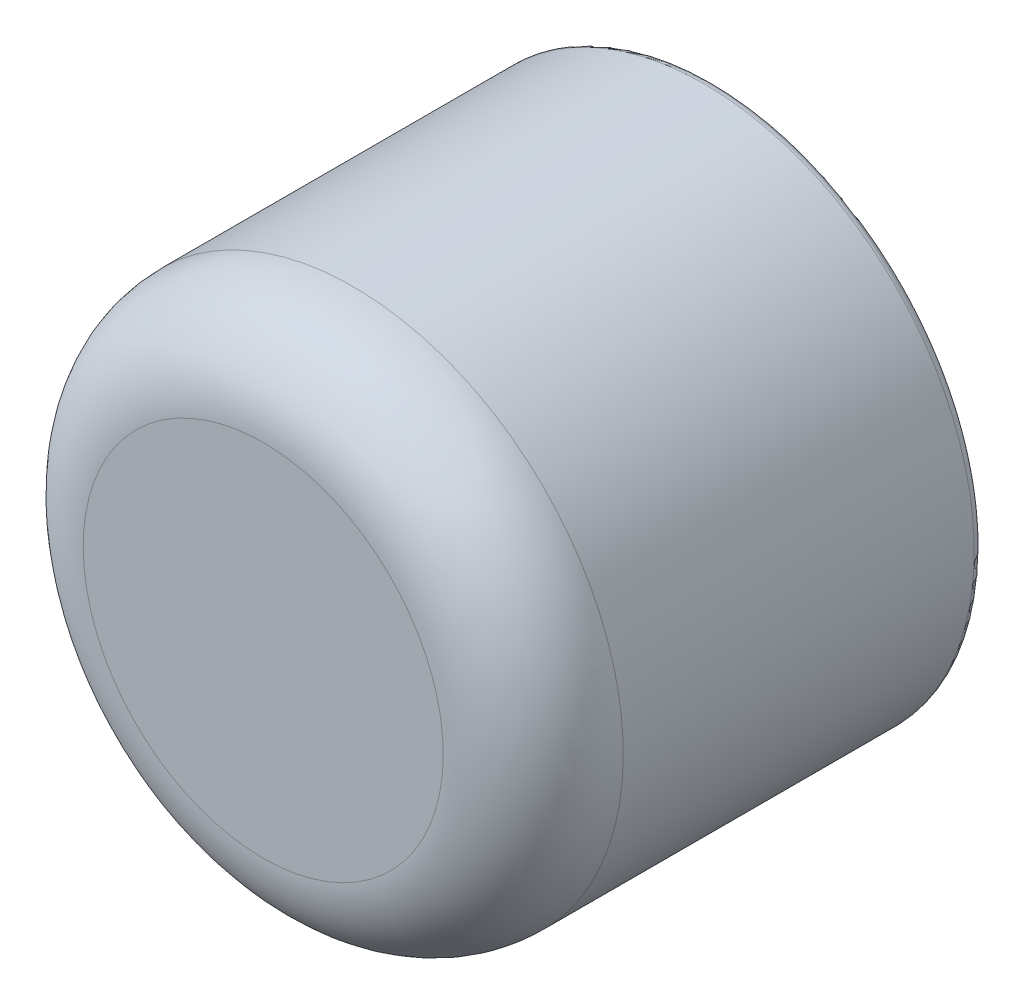
ISO-10303-21;
HEADER;
FILE_DESCRIPTION(('STEP AP214'),'2;1');
FILE_NAME('part.step','',(''),(''),'','','');
FILE_SCHEMA(('AUTOMOTIVE_DESIGN { 1 0 10303 214 1 1 1 1 }'));
ENDSEC;
DATA;
#1=APPLICATION_CONTEXT('core data for automotive mechanical design processes');
#2=APPLICATION_PROTOCOL_DEFINITION('international standard','automotive_design',2000,#1);
#3=PRODUCT_CONTEXT('',#1,'mechanical');
#4=PRODUCT('Part','Part','',(#3));
#5=PRODUCT_RELATED_PRODUCT_CATEGORY('part','',(#4));
#6=PRODUCT_DEFINITION_FORMATION('','',#4);
#7=PRODUCT_DEFINITION_CONTEXT('part definition',#1,'design');
#8=PRODUCT_DEFINITION('design','',#6,#7);
#9=PRODUCT_DEFINITION_SHAPE('','',#8);
#10=(LENGTH_UNIT() NAMED_UNIT(*) SI_UNIT(.MILLI.,.METRE.));
#11=(NAMED_UNIT(*) PLANE_ANGLE_UNIT() SI_UNIT($,.RADIAN.));
#12=(NAMED_UNIT(*) SI_UNIT($,.STERADIAN.) SOLID_ANGLE_UNIT());
#13=UNCERTAINTY_MEASURE_WITH_UNIT(LENGTH_MEASURE(1.E-05),#10,'distance_accuracy_value','');
#14=(GEOMETRIC_REPRESENTATION_CONTEXT(3) GLOBAL_UNCERTAINTY_ASSIGNED_CONTEXT((#13)) GLOBAL_UNIT_ASSIGNED_CONTEXT((#10,
#11,#12)) REPRESENTATION_CONTEXT('',''));
#15=CARTESIAN_POINT('',(0.,0.,0.));
#16=DIRECTION('',(0.,0.,1.));
#17=DIRECTION('',(1.,0.,0.));
#18=AXIS2_PLACEMENT_3D('',#15,#16,#17);
#19=CARTESIAN_POINT('',(0.,0.,12.5));
#20=DIRECTION('',(0.,0.,1.));
#21=DIRECTION('',(0.,-1.,0.));
#22=AXIS2_PLACEMENT_3D('',#19,#20,#21);
#23=PLANE('',#22);
#24=CARTESIAN_POINT('',(0.,0.,12.5));
#25=DIRECTION('',(0.,0.,1.));
#26=DIRECTION('',(0.,-1.,0.));
#27=AXIS2_PLACEMENT_3D('',#24,#25,#26);
#28=CIRCLE('',#27,10.);
#29=CARTESIAN_POINT('',(0.,-10.,12.5));
#30=VERTEX_POINT('',#29);
#31=EDGE_CURVE('E57',#30,#30,#28,.T.);
#32=ORIENTED_EDGE('',*,*,#31,.T.);
#33=EDGE_LOOP('',(#32));
#34=FACE_BOUND('',#33,.T.);
#35=ADVANCED_FACE('F41',(#34),#23,.T.);
#36=CARTESIAN_POINT('',(0.,0.,-12.5));
#37=DIRECTION('',(0.,0.,-1.));
#38=DIRECTION('',(0.,1.,0.));
#39=AXIS2_PLACEMENT_3D('',#36,#37,#38);
#40=PLANE('',#39);
#41=CARTESIAN_POINT('',(0.,0.,-12.5));
#42=DIRECTION('',(0.,0.,-1.));
#43=DIRECTION('',(0.,1.,0.));
#44=AXIS2_PLACEMENT_3D('',#41,#42,#43);
#45=CIRCLE('',#44,14.5);
#46=CARTESIAN_POINT('',(0.,14.5,-12.5));
#47=VERTEX_POINT('',#46);
#48=EDGE_CURVE('E10',#47,#47,#45,.T.);
#49=ORIENTED_EDGE('',*,*,#48,.T.);
#50=EDGE_LOOP('',(#49));
#51=FACE_BOUND('',#50,.T.);
#52=ADVANCED_FACE('F74',(#51),#40,.T.);
#53=CARTESIAN_POINT('',(0.,0.,22.3270440251572));
#54=DIRECTION('',(0.,0.,1.));
#55=DIRECTION('',(0.,-1.,0.));
#56=AXIS2_PLACEMENT_3D('',#53,#54,#55);
#57=CYLINDRICAL_SURFACE('',#56,15.);
#58=CARTESIAN_POINT('',(0.,0.,-12.));
#59=DIRECTION('',(0.,0.,-1.));
#60=DIRECTION('',(0.,1.,0.));
#61=AXIS2_PLACEMENT_3D('',#58,#59,#60);
#62=CIRCLE('',#61,15.);
#63=CARTESIAN_POINT('',(0.,15.,-12.));
#64=VERTEX_POINT('',#63);
#65=EDGE_CURVE('E48',#64,#64,#62,.F.);
#66=ORIENTED_EDGE('',*,*,#65,.T.);
#67=EDGE_LOOP('',(#66));
#68=FACE_BOUND('',#67,.T.);
#69=CARTESIAN_POINT('',(0.,0.,7.5));
#70=DIRECTION('',(0.,0.,1.));
#71=DIRECTION('',(0.,-1.,0.));
#72=AXIS2_PLACEMENT_3D('',#69,#70,#71);
#73=CIRCLE('',#72,15.);
#74=CARTESIAN_POINT('',(0.,-15.,7.5));
#75=VERTEX_POINT('',#74);
#76=EDGE_CURVE('E55',#75,#75,#73,.F.);
#77=ORIENTED_EDGE('',*,*,#76,.T.);
#78=EDGE_LOOP('',(#77));
#79=FACE_BOUND('',#78,.T.);
#80=ADVANCED_FACE('F63',(#68,#79),#57,.T.);
#81=CARTESIAN_POINT('',(0.,0.,7.5));
#82=DIRECTION('',(0.,0.,1.));
#83=DIRECTION('',(0.,-1.,0.));
#84=AXIS2_PLACEMENT_3D('',#81,#82,#83);
#85=TOROIDAL_SURFACE('',#84,10.,5.);
#86=ORIENTED_EDGE('',*,*,#76,.F.);
#87=EDGE_LOOP('',(#86));
#88=FACE_BOUND('',#87,.T.);
#89=ORIENTED_EDGE('',*,*,#31,.F.);
#90=EDGE_LOOP('',(#89));
#91=FACE_BOUND('',#90,.T.);
#92=ADVANCED_FACE('F64',(#88,#91),#85,.T.);
#93=CARTESIAN_POINT('',(0.,0.,-12.));
#94=DIRECTION('',(0.,0.,-1.));
#95=DIRECTION('',(0.,1.,0.));
#96=AXIS2_PLACEMENT_3D('',#93,#94,#95);
#97=TOROIDAL_SURFACE('',#96,14.5,0.5);
#98=ORIENTED_EDGE('',*,*,#48,.F.);
#99=EDGE_LOOP('',(#98));
#100=FACE_BOUND('',#99,.T.);
#101=ORIENTED_EDGE('',*,*,#65,.F.);
#102=EDGE_LOOP('',(#101));
#103=FACE_BOUND('',#102,.T.);
#104=ADVANCED_FACE('F43',(#100,#103),#97,.T.);
#105=CLOSED_SHELL('',(#35,#52,#80,#92,#104));
#106=MANIFOLD_SOLID_BREP('B2',#105);
#107=ADVANCED_BREP_SHAPE_REPRESENTATION('',(#18,#106),#14);
#108=SHAPE_DEFINITION_REPRESENTATION(#9,#107);
ENDSEC;
END-ISO-10303-21;
